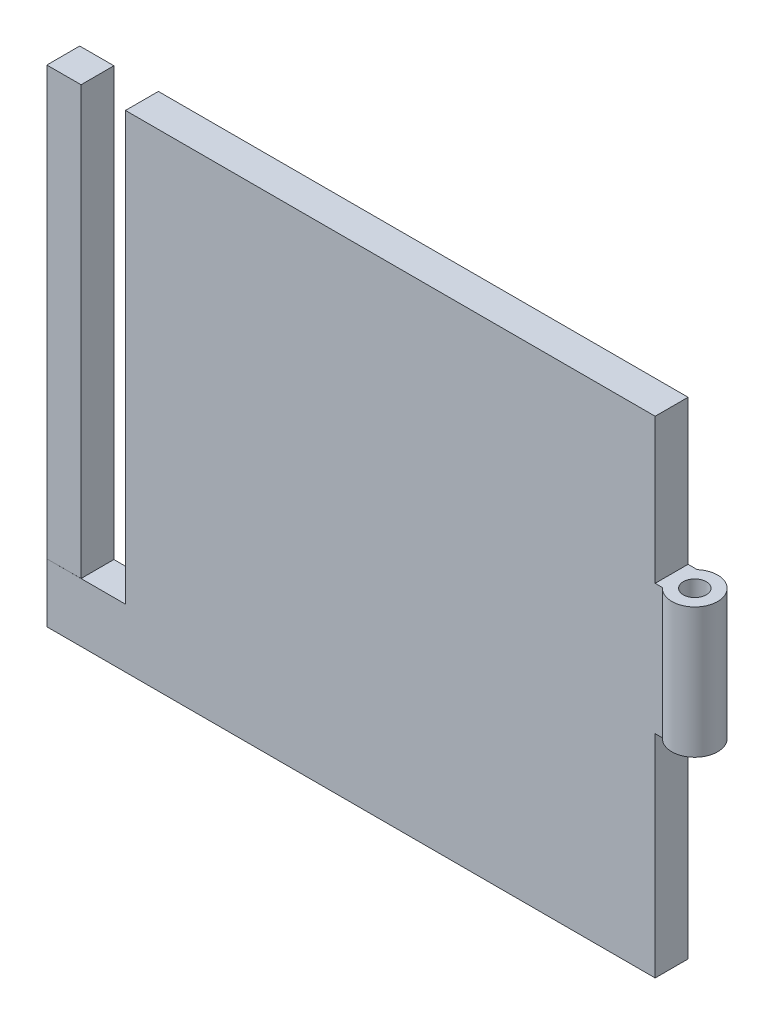
ISO-10303-21;
HEADER;
FILE_DESCRIPTION(('STEP AP214'),'2;1');
FILE_NAME('part.step','',(''),(''),'','','');
FILE_SCHEMA(('AUTOMOTIVE_DESIGN { 1 0 10303 214 1 1 1 1 }'));
ENDSEC;
DATA;
#1=APPLICATION_CONTEXT('core data for automotive mechanical design processes');
#2=APPLICATION_PROTOCOL_DEFINITION('international standard','automotive_design',2000,#1);
#3=PRODUCT_CONTEXT('',#1,'mechanical');
#4=PRODUCT('Part','Part','',(#3));
#5=PRODUCT_RELATED_PRODUCT_CATEGORY('part','',(#4));
#6=PRODUCT_DEFINITION_FORMATION('','',#4);
#7=PRODUCT_DEFINITION_CONTEXT('part definition',#1,'design');
#8=PRODUCT_DEFINITION('design','',#6,#7);
#9=PRODUCT_DEFINITION_SHAPE('','',#8);
#10=(LENGTH_UNIT() NAMED_UNIT(*) SI_UNIT(.MILLI.,.METRE.));
#11=(NAMED_UNIT(*) PLANE_ANGLE_UNIT() SI_UNIT($,.RADIAN.));
#12=(NAMED_UNIT(*) SI_UNIT($,.STERADIAN.) SOLID_ANGLE_UNIT());
#13=UNCERTAINTY_MEASURE_WITH_UNIT(LENGTH_MEASURE(1.E-05),#10,'distance_accuracy_value','');
#14=(GEOMETRIC_REPRESENTATION_CONTEXT(3) GLOBAL_UNCERTAINTY_ASSIGNED_CONTEXT((#13)) GLOBAL_UNIT_ASSIGNED_CONTEXT((#10,
#11,#12)) REPRESENTATION_CONTEXT('',''));
#15=CARTESIAN_POINT('',(0.,0.,0.));
#16=DIRECTION('',(0.,0.,1.));
#17=DIRECTION('',(1.,0.,0.));
#18=AXIS2_PLACEMENT_3D('',#15,#16,#17);
#19=CARTESIAN_POINT('',(38.845389233023,14.1569766759826,-40.7248142263542));
#20=DIRECTION('',(0.,1.,0.));
#21=DIRECTION('',(-1.,0.,0.));
#22=AXIS2_PLACEMENT_3D('',#19,#20,#21);
#23=CYLINDRICAL_SURFACE('',#22,1.49999999999999);
#24=CARTESIAN_POINT('',(38.8453892330233,31.4069766759827,-40.7248142263543));
#25=DIRECTION('',(0.,1.,0.));
#26=DIRECTION('',(-1.,0.,0.));
#27=AXIS2_PLACEMENT_3D('',#24,#25,#26);
#28=CIRCLE('',#27,1.49999999999999);
#29=CARTESIAN_POINT('',(37.3453892330233,31.4069766759827,-40.7248142263543));
#30=VERTEX_POINT('',#29);
#31=EDGE_CURVE('E19',#30,#30,#28,.F.);
#32=ORIENTED_EDGE('',*,*,#31,.F.);
#33=EDGE_LOOP('',(#32));
#34=FACE_BOUND('',#33,.T.);
#35=CARTESIAN_POINT('',(38.845389233023,14.3569766759827,-40.7248142263542));
#36=DIRECTION('',(0.,1.,0.));
#37=DIRECTION('',(-1.,0.,0.));
#38=AXIS2_PLACEMENT_3D('',#35,#36,#37);
#39=CIRCLE('',#38,1.49999999999999);
#40=CARTESIAN_POINT('',(37.345389233023,14.3569766759827,-40.7248142263542));
#41=VERTEX_POINT('',#40);
#42=EDGE_CURVE('E245',#41,#41,#39,.T.);
#43=ORIENTED_EDGE('',*,*,#42,.F.);
#44=EDGE_LOOP('',(#43));
#45=FACE_BOUND('',#44,.T.);
#46=ADVANCED_FACE('F16',(#34,#45),#23,.F.);
#47=CARTESIAN_POINT('',(-43.9734984134344,-5.64302343130154,-38.6900078520453));
#48=DIRECTION('',(0.00134974820594569,0.,0.999999089089475));
#49=DIRECTION('',(0.999999089089475,0.,-0.00134974820594569));
#50=AXIS2_PLACEMENT_3D('',#47,#48,#49);
#51=PLANE('',#50);
#52=DIRECTION('',(0.,1.,0.));
#53=VECTOR('',#52,1.);
#54=CARTESIAN_POINT('',(-43.9734984134344,-5.64302343130158,-38.6900078520453));
#55=LINE('',#54,#53);
#56=CARTESIAN_POINT('',(-43.9752546138436,-5.64302343130133,-38.6900031408231));
#57=VERTEX_POINT('',#56);
#58=CARTESIAN_POINT('',(-43.9734984134335,50.3569765686985,-38.6900078520456));
#59=VERTEX_POINT('',#58);
#60=EDGE_CURVE('E185',#57,#59,#55,.T.);
#61=ORIENTED_EDGE('',*,*,#60,.F.);
#62=DIRECTION('',(-0.999999089089475,0.,0.00134974820593793));
#63=VECTOR('',#62,1.);
#64=CARTESIAN_POINT('',(-39.4965918037003,-5.64302343130124,-38.6960505542143));
#65=LINE('',#64,#63);
#66=CARTESIAN_POINT('',(-39.4965918037003,-5.64302343130138,-38.6960505542143));
#67=VERTEX_POINT('',#66);
#68=EDGE_CURVE('E156',#67,#57,#65,.T.);
#69=ORIENTED_EDGE('',*,*,#68,.F.);
#70=DIRECTION('',(0.,1.,0.));
#71=VECTOR('',#70,1.);
#72=CARTESIAN_POINT('',(-39.4965918037003,-5.64302343130162,-38.6960505542143));
#73=LINE('',#72,#71);
#74=CARTESIAN_POINT('',(-39.4965918036994,50.3569765686984,-38.6960505542145));
#75=VERTEX_POINT('',#74);
#76=EDGE_CURVE('E165',#67,#75,#73,.T.);
#77=ORIENTED_EDGE('',*,*,#76,.T.);
#78=DIRECTION('',(0.999999089089475,0.,-0.00134974820593793));
#79=VECTOR('',#78,1.);
#80=CARTESIAN_POINT('',(-43.9734984134335,50.3569765686985,-38.6900078520458));
#81=LINE('',#80,#79);
#82=EDGE_CURVE('E167',#59,#75,#81,.T.);
#83=ORIENTED_EDGE('',*,*,#82,.F.);
#84=EDGE_LOOP('',(#61,#69,#77,#83));
#85=FACE_BOUND('',#84,.T.);
#86=ADVANCED_FACE('F346',(#85),#51,.T.);
#87=CARTESIAN_POINT('',(38.845389233022,31.4069766759834,-40.7248142263535));
#88=DIRECTION('',(0.,1.,0.));
#89=DIRECTION('',(0.,0.,1.));
#90=AXIS2_PLACEMENT_3D('',#87,#88,#89);
#91=PLANE('',#90);
#92=ORIENTED_EDGE('',*,*,#31,.T.);
#93=EDGE_LOOP('',(#92));
#94=FACE_BOUND('',#93,.T.);
#95=DIRECTION('',(1.,0.,0.));
#96=VECTOR('',#95,1.);
#97=CARTESIAN_POINT('',(-3.14423404429655,31.4069764779342,-38.69));
#98=LINE('',#97,#96);
#99=CARTESIAN_POINT('',(36.6409553742499,31.4069764779342,-38.6899994037494));
#100=VERTEX_POINT('',#99);
#101=CARTESIAN_POINT('',(35.6908477343092,31.4069764779342,-38.69));
#102=VERTEX_POINT('',#101);
#103=EDGE_CURVE('E315',#100,#102,#98,.F.);
#104=ORIENTED_EDGE('',*,*,#103,.F.);
#105=CARTESIAN_POINT('',(38.8453892330233,31.4069764779342,-40.7248142263543));
#106=DIRECTION('',(0.,1.,0.));
#107=DIRECTION('',(-1.,0.,0.));
#108=AXIS2_PLACEMENT_3D('',#105,#106,#107);
#109=CIRCLE('',#108,3.00000000000001);
#110=CARTESIAN_POINT('',(36.8900044383088,31.4069765769588,-43.));
#111=VERTEX_POINT('',#110);
#112=EDGE_CURVE('E256',#111,#100,#109,.F.);
#113=ORIENTED_EDGE('',*,*,#112,.F.);
#114=DIRECTION('',(1.,0.,0.));
#115=VECTOR('',#114,1.);
#116=CARTESIAN_POINT('',(38.845389233022,31.4069766759834,-43.));
#117=LINE('',#116,#115);
#118=CARTESIAN_POINT('',(35.6908477343095,31.4069765769588,-43.));
#119=VERTEX_POINT('',#118);
#120=EDGE_CURVE('E304',#111,#119,#117,.F.);
#121=ORIENTED_EDGE('',*,*,#120,.T.);
#122=DIRECTION('',(0.,0.,-1.));
#123=VECTOR('',#122,1.);
#124=CARTESIAN_POINT('',(35.6908477343095,31.4069764779342,-40.));
#125=LINE('',#124,#123);
#126=EDGE_CURVE('E153',#102,#119,#125,.T.);
#127=ORIENTED_EDGE('',*,*,#126,.F.);
#128=EDGE_LOOP('',(#104,#113,#121,#127));
#129=FACE_BOUND('',#128,.T.);
#130=ADVANCED_FACE('F463',(#94,#129),#91,.T.);
#131=CARTESIAN_POINT('',(36.6908477343091,14.3569768845997,-39.7248148074986));
#132=DIRECTION('',(0.,-1.,0.));
#133=DIRECTION('',(0.,0.,-1.));
#134=AXIS2_PLACEMENT_3D('',#131,#132,#133);
#135=PLANE('',#134);
#136=ORIENTED_EDGE('',*,*,#42,.T.);
#137=EDGE_LOOP('',(#136));
#138=FACE_BOUND('',#137,.T.);
#139=DIRECTION('',(1.,0.,0.));
#140=VECTOR('',#139,1.);
#141=CARTESIAN_POINT('',(-3.14423404429655,14.3569768845997,-38.69));
#142=LINE('',#141,#140);
#143=CARTESIAN_POINT('',(35.6908477343093,14.3569768845997,-38.69));
#144=VERTEX_POINT('',#143);
#145=CARTESIAN_POINT('',(36.6409553742495,14.3569768845997,-38.6899994037493));
#146=VERTEX_POINT('',#145);
#147=EDGE_CURVE('E244',#144,#146,#142,.T.);
#148=ORIENTED_EDGE('',*,*,#147,.F.);
#149=DIRECTION('',(0.,0.,-1.));
#150=VECTOR('',#149,1.);
#151=CARTESIAN_POINT('',(35.6908477343095,14.3569768845997,-40.));
#152=LINE('',#151,#150);
#153=CARTESIAN_POINT('',(35.6908477343093,14.3569768845997,-43.));
#154=VERTEX_POINT('',#153);
#155=EDGE_CURVE('E262',#154,#144,#152,.F.);
#156=ORIENTED_EDGE('',*,*,#155,.F.);
#157=DIRECTION('',(1.,0.,0.));
#158=VECTOR('',#157,1.);
#159=CARTESIAN_POINT('',(36.6908477343091,14.3569768845997,-43.));
#160=LINE('',#159,#158);
#161=CARTESIAN_POINT('',(36.8900044383088,14.3569768845997,-43.));
#162=VERTEX_POINT('',#161);
#163=EDGE_CURVE('E296',#154,#162,#160,.T.);
#164=ORIENTED_EDGE('',*,*,#163,.T.);
#165=CARTESIAN_POINT('',(38.845389233023,14.3569768845996,-40.7248142263542));
#166=DIRECTION('',(0.,1.,0.));
#167=DIRECTION('',(-1.,0.,0.));
#168=AXIS2_PLACEMENT_3D('',#165,#166,#167);
#169=CIRCLE('',#168,3.00000000000001);
#170=EDGE_CURVE('E267',#146,#162,#169,.T.);
#171=ORIENTED_EDGE('',*,*,#170,.F.);
#172=EDGE_LOOP('',(#148,#156,#164,#171));
#173=FACE_BOUND('',#172,.T.);
#174=ADVANCED_FACE('F228',(#138,#173),#135,.T.);
#175=CARTESIAN_POINT('',(-43.9770108229026,-7.3535604520114,-40.));
#176=DIRECTION('',(1.,0.,0.));
#177=DIRECTION('',(0.,0.,-1.));
#178=AXIS2_PLACEMENT_3D('',#175,#176,#177);
#179=PLANE('',#178);
#180=DIRECTION('',(0.,0.,-1.));
#181=VECTOR('',#180,1.);
#182=CARTESIAN_POINT('',(-43.9770108229026,-13.3535604520114,-40.));
#183=LINE('',#182,#181);
#184=CARTESIAN_POINT('',(-43.9770108229026,-13.3535604520114,-38.69));
#185=VERTEX_POINT('',#184);
#186=CARTESIAN_POINT('',(-43.9770108229026,-13.3535604520114,-41.2922756329365));
#187=VERTEX_POINT('',#186);
#188=EDGE_CURVE('E261',#185,#187,#183,.T.);
#189=ORIENTED_EDGE('',*,*,#188,.F.);
#190=DIRECTION('',(0.,1.,0.));
#191=VECTOR('',#190,1.);
#192=CARTESIAN_POINT('',(-43.9770108229026,22.8817933312672,-38.69));
#193=LINE('',#192,#191);
#194=EDGE_CURVE('E236',#57,#185,#193,.F.);
#195=ORIENTED_EDGE('',*,*,#194,.F.);
#196=CARTESIAN_POINT('',(-43.9770108229026,-5.64302343130127,-41.2922756329813));
#197=DIRECTION('',(0.0013497482059431,0.,0.999999089089475));
#198=VECTOR('',#197,1.);
#199=LINE('',#196,#198);
#200=CARTESIAN_POINT('',(-43.9770108229026,-5.64302343130127,-41.2922756329813));
#201=VERTEX_POINT('',#200);
#202=EDGE_CURVE('E187',#201,#57,#199,.T.);
#203=ORIENTED_EDGE('',*,*,#202,.F.);
#204=DIRECTION('',(0.,1.,0.));
#205=VECTOR('',#204,1.);
#206=CARTESIAN_POINT('',(-43.9770108229026,-5.64302343130158,-41.2922756329813));
#207=LINE('',#206,#205);
#208=EDGE_CURVE('E182',#187,#201,#207,.T.);
#209=ORIENTED_EDGE('',*,*,#208,.F.);
#210=EDGE_LOOP('',(#189,#195,#203,#209));
#211=FACE_BOUND('',#210,.T.);
#212=ADVANCED_FACE('F223',(#211),#179,.F.);
#213=CARTESIAN_POINT('',(-3.14423404429655,22.8817933312672,-38.69));
#214=DIRECTION('',(0.,0.,1.));
#215=DIRECTION('',(1.,0.,0.));
#216=AXIS2_PLACEMENT_3D('',#213,#214,#215);
#217=PLANE('',#216);
#218=DIRECTION('',(1.,0.,0.));
#219=VECTOR('',#218,1.);
#220=CARTESIAN_POINT('',(-33.8787431089121,-5.64302343130128,-38.69));
#221=LINE('',#220,#219);
#222=CARTESIAN_POINT('',(-33.6787431089121,-5.64302343130128,-38.6900000059893));
#223=VERTEX_POINT('',#222);
#224=EDGE_CURVE('E121',#57,#223,#221,.T.);
#225=ORIENTED_EDGE('',*,*,#224,.F.);
#226=ORIENTED_EDGE('',*,*,#194,.T.);
#227=DIRECTION('',(1.,0.,0.));
#228=VECTOR('',#227,1.);
#229=CARTESIAN_POINT('',(35.6908477343095,-13.3535604520114,-38.69));
#230=LINE('',#229,#228);
#231=CARTESIAN_POINT('',(35.6908477343095,-13.3535604520114,-38.6899994037493));
#232=VERTEX_POINT('',#231);
#233=EDGE_CURVE('E196',#232,#185,#230,.F.);
#234=ORIENTED_EDGE('',*,*,#233,.F.);
#235=DIRECTION('',(0.,1.,0.));
#236=VECTOR('',#235,1.);
#237=CARTESIAN_POINT('',(35.6908477343095,53.1171471145459,-38.6899988074986));
#238=LINE('',#237,#236);
#239=EDGE_CURVE('E259',#144,#232,#238,.F.);
#240=ORIENTED_EDGE('',*,*,#239,.F.);
#241=ORIENTED_EDGE('',*,*,#147,.T.);
#242=DIRECTION('',(0.,1.,0.));
#243=VECTOR('',#242,1.);
#244=CARTESIAN_POINT('',(36.640955924622,14.1569766759826,-38.6899988074986));
#245=LINE('',#244,#243);
#246=EDGE_CURVE('E290',#100,#146,#245,.F.);
#247=ORIENTED_EDGE('',*,*,#246,.F.);
#248=ORIENTED_EDGE('',*,*,#103,.T.);
#249=DIRECTION('',(0.,1.,0.));
#250=VECTOR('',#249,1.);
#251=CARTESIAN_POINT('',(35.6908477343095,53.1171471145459,-38.69));
#252=LINE('',#251,#250);
#253=CARTESIAN_POINT('',(35.6908477343094,50.3571471145459,-38.69));
#254=VERTEX_POINT('',#253);
#255=EDGE_CURVE('E253',#254,#102,#252,.F.);
#256=ORIENTED_EDGE('',*,*,#255,.F.);
#257=DIRECTION('',(1.,0.,0.));
#258=VECTOR('',#257,1.);
#259=CARTESIAN_POINT('',(-41.9793158229026,50.3571471145459,-38.69));
#260=LINE('',#259,#258);
#261=CARTESIAN_POINT('',(-33.6787431089119,50.3571471145459,-38.6900000119785));
#262=VERTEX_POINT('',#261);
#263=EDGE_CURVE('E124',#254,#262,#260,.F.);
#264=ORIENTED_EDGE('',*,*,#263,.T.);
#265=DIRECTION('',(0.,1.,0.));
#266=VECTOR('',#265,1.);
#267=CARTESIAN_POINT('',(-33.6787431089119,50.3571471145454,-38.6900000119785));
#268=LINE('',#267,#266);
#269=EDGE_CURVE('E125',#262,#223,#268,.F.);
#270=ORIENTED_EDGE('',*,*,#269,.T.);
#271=EDGE_LOOP('',(#225,#226,#234,#240,#241,#247,#248,#256,#264,#270));
#272=FACE_BOUND('',#271,.T.);
#273=ADVANCED_FACE('F219',(#272),#217,.T.);
#274=CARTESIAN_POINT('',(-43.9793158229029,-5.64302343130158,-43.0000000000002));
#275=DIRECTION('',(-0.999999089089475,0.,0.00134974820594569));
#276=DIRECTION('',(0.00134974820594569,0.,0.999999089089475));
#277=AXIS2_PLACEMENT_3D('',#274,#275,#276);
#278=PLANE('',#277);
#279=DIRECTION('',(-0.00134974820578525,0.,-0.999999089089476));
#280=VECTOR('',#279,1.);
#281=CARTESIAN_POINT('',(-43.9770108229026,-13.3535604520114,-41.2922756329813));
#282=LINE('',#281,#280);
#283=CARTESIAN_POINT('',(-43.9793158229028,-13.3535604520114,-43.0000000000003));
#284=VERTEX_POINT('',#283);
#285=EDGE_CURVE('E272',#187,#284,#282,.T.);
#286=ORIENTED_EDGE('',*,*,#285,.F.);
#287=ORIENTED_EDGE('',*,*,#208,.T.);
#288=ORIENTED_EDGE('',*,*,#202,.T.);
#289=ORIENTED_EDGE('',*,*,#60,.T.);
#290=DIRECTION('',(0.00134974820594972,0.,0.999999089089475));
#291=VECTOR('',#290,1.);
#292=CARTESIAN_POINT('',(-43.979315822902,50.3569765686984,-43.0000000000007));
#293=LINE('',#292,#291);
#294=CARTESIAN_POINT('',(-43.979315822902,50.3569765686984,-43.0000000000005));
#295=VERTEX_POINT('',#294);
#296=EDGE_CURVE('E174',#295,#59,#293,.T.);
#297=ORIENTED_EDGE('',*,*,#296,.F.);
#298=DIRECTION('',(0.,1.,0.));
#299=VECTOR('',#298,1.);
#300=CARTESIAN_POINT('',(-43.9793158229026,22.8817933312672,-43.));
#301=LINE('',#300,#299);
#302=EDGE_CURVE('E191',#284,#295,#301,.T.);
#303=ORIENTED_EDGE('',*,*,#302,.F.);
#304=EDGE_LOOP('',(#286,#287,#288,#289,#297,#303));
#305=FACE_BOUND('',#304,.T.);
#306=ADVANCED_FACE('F208',(#305),#278,.T.);
#307=CARTESIAN_POINT('',(-41.7379538133007,50.3569765686984,-40.8480252771077));
#308=DIRECTION('',(0.,1.,0.));
#309=DIRECTION('',(-1.,0.,0.));
#310=AXIS2_PLACEMENT_3D('',#307,#308,#309);
#311=PLANE('',#310);
#312=ORIENTED_EDGE('',*,*,#296,.T.);
#313=ORIENTED_EDGE('',*,*,#82,.T.);
#314=DIRECTION('',(0.00134974820595879,0.,0.999999089089475));
#315=VECTOR('',#314,1.);
#316=CARTESIAN_POINT('',(-39.4965918036994,50.3569765686984,-38.6960505542143));
#317=LINE('',#316,#315);
#318=CARTESIAN_POINT('',(-39.502401057034,50.3569765686984,-43.0000000000005));
#319=VERTEX_POINT('',#318);
#320=EDGE_CURVE('E162',#75,#319,#317,.F.);
#321=ORIENTED_EDGE('',*,*,#320,.T.);
#322=DIRECTION('',(-1.,0.,0.));
#323=VECTOR('',#322,1.);
#324=CARTESIAN_POINT('',(-3.14423404429655,50.3569765686984,-43.));
#325=LINE('',#324,#323);
#326=EDGE_CURVE('E143',#295,#319,#325,.F.);
#327=ORIENTED_EDGE('',*,*,#326,.F.);
#328=EDGE_LOOP('',(#312,#313,#321,#327));
#329=FACE_BOUND('',#328,.T.);
#330=ADVANCED_FACE('F218',(#329),#311,.T.);
#331=CARTESIAN_POINT('',(-39.4965918037003,-5.64302343130162,-38.6960505542143));
#332=DIRECTION('',(-0.999999089089475,0.,0.00134974820595879));
#333=DIRECTION('',(0.00134974820595879,0.,0.999999089089475));
#334=AXIS2_PLACEMENT_3D('',#331,#332,#333);
#335=PLANE('',#334);
#336=DIRECTION('',(0.,1.,0.));
#337=VECTOR('',#336,1.);
#338=CARTESIAN_POINT('',(-39.502401057034,22.8817933312672,-43.));
#339=LINE('',#338,#337);
#340=CARTESIAN_POINT('',(-39.5024010570349,-5.64302343130147,-42.9999999999918));
#341=VERTEX_POINT('',#340);
#342=EDGE_CURVE('E141',#319,#341,#339,.F.);
#343=ORIENTED_EDGE('',*,*,#342,.F.);
#344=ORIENTED_EDGE('',*,*,#320,.F.);
#345=ORIENTED_EDGE('',*,*,#76,.F.);
#346=DIRECTION('',(0.00134974820596019,0.,0.999999089089475));
#347=VECTOR('',#346,1.);
#348=CARTESIAN_POINT('',(-39.502401057035,-5.64302343130128,-43.0000000000002));
#349=LINE('',#348,#347);
#350=EDGE_CURVE('E158',#341,#67,#349,.T.);
#351=ORIENTED_EDGE('',*,*,#350,.F.);
#352=EDGE_LOOP('',(#343,#344,#345,#351));
#353=FACE_BOUND('',#352,.T.);
#354=ADVANCED_FACE('F348',(#353),#335,.F.);
#355=CARTESIAN_POINT('',(-33.8787431089121,-5.64302343130128,-38.6900000120449));
#356=DIRECTION('',(0.,1.,0.));
#357=DIRECTION('',(0.,0.,1.));
#358=AXIS2_PLACEMENT_3D('',#355,#356,#357);
#359=PLANE('',#358);
#360=ORIENTED_EDGE('',*,*,#224,.T.);
#361=DIRECTION('',(0.,0.,1.));
#362=VECTOR('',#361,1.);
#363=CARTESIAN_POINT('',(-33.6787431089121,-5.64302343130128,-38.6900000120449));
#364=LINE('',#363,#362);
#365=CARTESIAN_POINT('',(-33.6787431081911,-5.64302343130158,-43.));
#366=VERTEX_POINT('',#365);
#367=EDGE_CURVE('E112',#223,#366,#364,.F.);
#368=ORIENTED_EDGE('',*,*,#367,.T.);
#369=DIRECTION('',(-1.,0.,0.));
#370=VECTOR('',#369,1.);
#371=CARTESIAN_POINT('',(-3.14423404429655,-5.64302343130166,-43.));
#372=LINE('',#371,#370);
#373=EDGE_CURVE('E117',#341,#366,#372,.F.);
#374=ORIENTED_EDGE('',*,*,#373,.F.);
#375=ORIENTED_EDGE('',*,*,#350,.T.);
#376=ORIENTED_EDGE('',*,*,#68,.T.);
#377=EDGE_LOOP('',(#360,#368,#374,#375,#376));
#378=FACE_BOUND('',#377,.T.);
#379=ADVANCED_FACE('F114',(#378),#359,.T.);
#380=CARTESIAN_POINT('',(-33.6787431089119,50.3571471145454,-38.6900000119785));
#381=DIRECTION('',(1.,0.,3.34594574269432E-10));
#382=DIRECTION('',(3.34594574269432E-10,0.,-1.));
#383=AXIS2_PLACEMENT_3D('',#380,#381,#382);
#384=PLANE('',#383);
#385=ORIENTED_EDGE('',*,*,#269,.F.);
#386=DIRECTION('',(0.,0.,-1.));
#387=VECTOR('',#386,1.);
#388=CARTESIAN_POINT('',(-33.6787431089118,50.3571471145459,-40.));
#389=LINE('',#388,#387);
#390=CARTESIAN_POINT('',(-33.6787431078304,50.3571471145459,-42.9999999999498));
#391=VERTEX_POINT('',#390);
#392=EDGE_CURVE('E131',#262,#391,#389,.T.);
#393=ORIENTED_EDGE('',*,*,#392,.T.);
#394=DIRECTION('',(0.,1.,0.));
#395=VECTOR('',#394,1.);
#396=CARTESIAN_POINT('',(-33.6787431074701,22.8817933312672,-43.));
#397=LINE('',#396,#395);
#398=EDGE_CURVE('E128',#366,#391,#397,.T.);
#399=ORIENTED_EDGE('',*,*,#398,.F.);
#400=ORIENTED_EDGE('',*,*,#367,.F.);
#401=EDGE_LOOP('',(#385,#393,#399,#400));
#402=FACE_BOUND('',#401,.T.);
#403=ADVANCED_FACE('F129',(#402),#384,.F.);
#404=CARTESIAN_POINT('',(-41.9793158229026,50.3571471145459,-40.));
#405=DIRECTION('',(0.,-1.,0.));
#406=DIRECTION('',(0.,0.,-1.));
#407=AXIS2_PLACEMENT_3D('',#404,#405,#406);
#408=PLANE('',#407);
#409=ORIENTED_EDGE('',*,*,#263,.F.);
#410=DIRECTION('',(0.,0.,-1.));
#411=VECTOR('',#410,1.);
#412=CARTESIAN_POINT('',(35.6908477343095,50.3571471145459,-40.));
#413=LINE('',#412,#411);
#414=CARTESIAN_POINT('',(35.6908477343095,50.3571471145459,-42.9999999999665));
#415=VERTEX_POINT('',#414);
#416=EDGE_CURVE('E250',#415,#254,#413,.F.);
#417=ORIENTED_EDGE('',*,*,#416,.F.);
#418=DIRECTION('',(-1.,0.,0.));
#419=VECTOR('',#418,1.);
#420=CARTESIAN_POINT('',(-3.14423404429655,50.3571471145459,-43.));
#421=LINE('',#420,#419);
#422=EDGE_CURVE('E135',#391,#415,#421,.F.);
#423=ORIENTED_EDGE('',*,*,#422,.F.);
#424=ORIENTED_EDGE('',*,*,#392,.F.);
#425=EDGE_LOOP('',(#409,#417,#423,#424));
#426=FACE_BOUND('',#425,.T.);
#427=ADVANCED_FACE('F329',(#426),#408,.F.);
#428=CARTESIAN_POINT('',(35.6908477343095,53.1171471145459,-40.));
#429=DIRECTION('',(1.,0.,0.));
#430=DIRECTION('',(0.,0.,-1.));
#431=AXIS2_PLACEMENT_3D('',#428,#429,#430);
#432=PLANE('',#431);
#433=ORIENTED_EDGE('',*,*,#416,.T.);
#434=ORIENTED_EDGE('',*,*,#255,.T.);
#435=ORIENTED_EDGE('',*,*,#126,.T.);
#436=DIRECTION('',(0.,1.,0.));
#437=VECTOR('',#436,1.);
#438=CARTESIAN_POINT('',(35.6908477343095,22.8817933312672,-43.));
#439=LINE('',#438,#437);
#440=EDGE_CURVE('E283',#415,#119,#439,.F.);
#441=ORIENTED_EDGE('',*,*,#440,.F.);
#442=EDGE_LOOP('',(#433,#434,#435,#441));
#443=FACE_BOUND('',#442,.T.);
#444=ADVANCED_FACE('F369',(#443),#432,.T.);
#445=CARTESIAN_POINT('',(38.845389233023,14.1569766759826,-40.7248142263542));
#446=DIRECTION('',(0.,1.,0.));
#447=DIRECTION('',(-1.,0.,0.));
#448=AXIS2_PLACEMENT_3D('',#445,#446,#447);
#449=CYLINDRICAL_SURFACE('',#448,3.00000000000001);
#450=ORIENTED_EDGE('',*,*,#246,.T.);
#451=ORIENTED_EDGE('',*,*,#170,.T.);
#452=DIRECTION('',(0.,1.,0.));
#453=VECTOR('',#452,1.);
#454=CARTESIAN_POINT('',(36.8900044383088,22.8817933312672,-43.));
#455=LINE('',#454,#453);
#456=EDGE_CURVE('E280',#111,#162,#455,.F.);
#457=ORIENTED_EDGE('',*,*,#456,.F.);
#458=ORIENTED_EDGE('',*,*,#112,.T.);
#459=EDGE_LOOP('',(#450,#451,#457,#458));
#460=FACE_BOUND('',#459,.T.);
#461=ADVANCED_FACE('F366',(#460),#449,.T.);
#462=CARTESIAN_POINT('',(35.6908477343095,53.1171471145459,-40.));
#463=DIRECTION('',(1.,0.,0.));
#464=DIRECTION('',(0.,0.,-1.));
#465=AXIS2_PLACEMENT_3D('',#462,#463,#464);
#466=PLANE('',#465);
#467=DIRECTION('',(0.,0.,-1.));
#468=VECTOR('',#467,1.);
#469=CARTESIAN_POINT('',(35.6908477343095,-13.3535604520114,-40.));
#470=LINE('',#469,#468);
#471=CARTESIAN_POINT('',(35.6908477343094,-13.3535604520114,-43.));
#472=VERTEX_POINT('',#471);
#473=EDGE_CURVE('E34',#472,#232,#470,.F.);
#474=ORIENTED_EDGE('',*,*,#473,.F.);
#475=DIRECTION('',(0.,1.,0.));
#476=VECTOR('',#475,1.);
#477=CARTESIAN_POINT('',(35.6908477343091,22.8817933312672,-43.));
#478=LINE('',#477,#476);
#479=EDGE_CURVE('E25',#154,#472,#478,.F.);
#480=ORIENTED_EDGE('',*,*,#479,.F.);
#481=ORIENTED_EDGE('',*,*,#155,.T.);
#482=ORIENTED_EDGE('',*,*,#239,.T.);
#483=EDGE_LOOP('',(#474,#480,#481,#482));
#484=FACE_BOUND('',#483,.T.);
#485=ADVANCED_FACE('F338',(#484),#466,.T.);
#486=CARTESIAN_POINT('',(35.6908477343095,-13.3535604520114,-40.));
#487=DIRECTION('',(0.,-1.,0.));
#488=DIRECTION('',(0.,0.,-1.));
#489=AXIS2_PLACEMENT_3D('',#486,#487,#488);
#490=PLANE('',#489);
#491=ORIENTED_EDGE('',*,*,#473,.T.);
#492=ORIENTED_EDGE('',*,*,#233,.T.);
#493=ORIENTED_EDGE('',*,*,#188,.T.);
#494=ORIENTED_EDGE('',*,*,#285,.T.);
#495=DIRECTION('',(-1.,0.,0.));
#496=VECTOR('',#495,1.);
#497=CARTESIAN_POINT('',(-3.14423404429655,-13.3535604520114,-43.));
#498=LINE('',#497,#496);
#499=EDGE_CURVE('E11',#472,#284,#498,.T.);
#500=ORIENTED_EDGE('',*,*,#499,.F.);
#501=EDGE_LOOP('',(#491,#492,#493,#494,#500));
#502=FACE_BOUND('',#501,.T.);
#503=ADVANCED_FACE('F337',(#502),#490,.T.);
#504=CARTESIAN_POINT('',(-3.14423404429655,22.8817933312672,-43.));
#505=DIRECTION('',(0.,0.,-1.));
#506=DIRECTION('',(-1.,0.,0.));
#507=AXIS2_PLACEMENT_3D('',#504,#505,#506);
#508=PLANE('',#507);
#509=ORIENTED_EDGE('',*,*,#479,.T.);
#510=ORIENTED_EDGE('',*,*,#499,.T.);
#511=ORIENTED_EDGE('',*,*,#302,.T.);
#512=ORIENTED_EDGE('',*,*,#326,.T.);
#513=ORIENTED_EDGE('',*,*,#342,.T.);
#514=ORIENTED_EDGE('',*,*,#373,.T.);
#515=ORIENTED_EDGE('',*,*,#398,.T.);
#516=ORIENTED_EDGE('',*,*,#422,.T.);
#517=ORIENTED_EDGE('',*,*,#440,.T.);
#518=ORIENTED_EDGE('',*,*,#120,.F.);
#519=ORIENTED_EDGE('',*,*,#456,.T.);
#520=ORIENTED_EDGE('',*,*,#163,.F.);
#521=EDGE_LOOP('',(#509,#510,#511,#512,#513,#514,#515,#516,#517,#518,#519,#520));
#522=FACE_BOUND('',#521,.T.);
#523=ADVANCED_FACE('F138',(#522),#508,.T.);
#524=CLOSED_SHELL('',(#46,#86,#130,#174,#212,#273,#306,#330,#354,#379,#403,#427,#444,#461,#485,
#503,#523));
#525=MANIFOLD_SOLID_BREP('B1',#524);
#526=ADVANCED_BREP_SHAPE_REPRESENTATION('',(#18,#525),#14);
#527=SHAPE_DEFINITION_REPRESENTATION(#9,#526);
ENDSEC;
END-ISO-10303-21;
